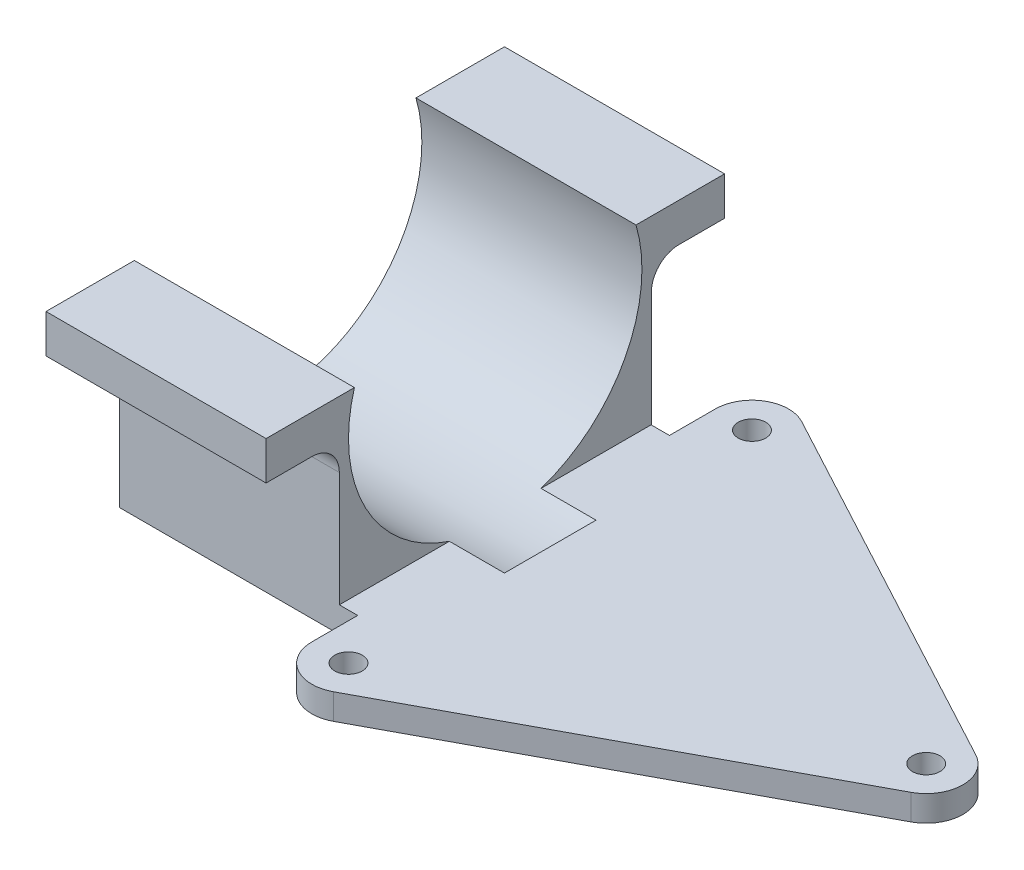
ISO-10303-21;
HEADER;
FILE_DESCRIPTION(('STEP AP214'),'2;1');
FILE_NAME('part.step','',(''),(''),'','','');
FILE_SCHEMA(('AUTOMOTIVE_DESIGN { 1 0 10303 214 1 1 1 1 }'));
ENDSEC;
DATA;
#1=APPLICATION_CONTEXT('core data for automotive mechanical design processes');
#2=APPLICATION_PROTOCOL_DEFINITION('international standard','automotive_design',2000,#1);
#3=PRODUCT_CONTEXT('',#1,'mechanical');
#4=PRODUCT('Part','Part','',(#3));
#5=PRODUCT_RELATED_PRODUCT_CATEGORY('part','',(#4));
#6=PRODUCT_DEFINITION_FORMATION('','',#4);
#7=PRODUCT_DEFINITION_CONTEXT('part definition',#1,'design');
#8=PRODUCT_DEFINITION('design','',#6,#7);
#9=PRODUCT_DEFINITION_SHAPE('','',#8);
#10=(LENGTH_UNIT() NAMED_UNIT(*) SI_UNIT(.MILLI.,.METRE.));
#11=(NAMED_UNIT(*) PLANE_ANGLE_UNIT() SI_UNIT($,.RADIAN.));
#12=(NAMED_UNIT(*) SI_UNIT($,.STERADIAN.) SOLID_ANGLE_UNIT());
#13=UNCERTAINTY_MEASURE_WITH_UNIT(LENGTH_MEASURE(1.E-05),#10,'distance_accuracy_value','');
#14=(GEOMETRIC_REPRESENTATION_CONTEXT(3) GLOBAL_UNCERTAINTY_ASSIGNED_CONTEXT((#13)) GLOBAL_UNIT_ASSIGNED_CONTEXT((#10,
#11,#12)) REPRESENTATION_CONTEXT('',''));
#15=CARTESIAN_POINT('',(0.,0.,0.));
#16=DIRECTION('',(0.,0.,1.));
#17=DIRECTION('',(1.,0.,0.));
#18=AXIS2_PLACEMENT_3D('',#15,#16,#17);
#19=CARTESIAN_POINT('',(-1.99999999999999,18.3,17.));
#20=DIRECTION('',(-1.,0.,0.));
#21=DIRECTION('',(0.,0.,1.));
#22=AXIS2_PLACEMENT_3D('',#19,#20,#21);
#23=PLANE('',#22);
#24=DIRECTION('',(0.,0.,-1.));
#25=VECTOR('',#24,1.);
#26=CARTESIAN_POINT('',(-1.99999999999999,22.5,24.9888259179975));
#27=LINE('',#26,#25);
#28=CARTESIAN_POINT('',(-1.99999999999999,22.5,-15.3541525327841));
#29=VERTEX_POINT('',#28);
#30=CARTESIAN_POINT('',(-1.99999999999999,22.5,-25.0111740820025));
#31=VERTEX_POINT('',#30);
#32=EDGE_CURVE('E566',#29,#31,#27,.T.);
#33=ORIENTED_EDGE('',*,*,#32,.F.);
#34=CARTESIAN_POINT('',(-1.99999999999999,18.,0.));
#35=DIRECTION('',(-1.,0.,0.));
#36=DIRECTION('',(0.,0.,1.));
#37=AXIS2_PLACEMENT_3D('',#34,#35,#36);
#38=CIRCLE('',#37,16.);
#39=CARTESIAN_POINT('',(-2.,2.8,-4.99599839871872));
#40=VERTEX_POINT('',#39);
#41=EDGE_CURVE('E189',#29,#40,#38,.T.);
#42=ORIENTED_EDGE('',*,*,#41,.T.);
#43=DIRECTION('',(0.,0.,-1.));
#44=VECTOR('',#43,1.);
#45=CARTESIAN_POINT('',(-1.99999999999999,2.8,17.));
#46=LINE('',#45,#44);
#47=CARTESIAN_POINT('',(-2.,2.8,-17.));
#48=VERTEX_POINT('',#47);
#49=EDGE_CURVE('E241',#40,#48,#46,.T.);
#50=ORIENTED_EDGE('',*,*,#49,.T.);
#51=CARTESIAN_POINT('',(-2.,2.8,-17.0223481640051));
#52=VERTEX_POINT('',#51);
#53=EDGE_CURVE('E237',#48,#52,#46,.T.);
#54=ORIENTED_EDGE('',*,*,#53,.T.);
#55=DIRECTION('',(0.,-1.,0.));
#56=VECTOR('',#55,1.);
#57=CARTESIAN_POINT('',(-2.,18.3,-17.0223481640051));
#58=LINE('',#57,#56);
#59=CARTESIAN_POINT('',(-2.,15.3,-17.0223481640051));
#60=VERTEX_POINT('',#59);
#61=EDGE_CURVE('E270',#60,#52,#58,.T.);
#62=ORIENTED_EDGE('',*,*,#61,.F.);
#63=CARTESIAN_POINT('',(-2.,15.3,-20.0223494646309));
#64=DIRECTION('',(-1.,0.,0.));
#65=DIRECTION('',(0.,0.,-1.));
#66=AXIS2_PLACEMENT_3D('',#63,#64,#65);
#67=ELLIPSE('',#66,3.00000130062585,3.);
#68=CARTESIAN_POINT('',(-1.99999999999999,18.3,-20.0223494646309));
#69=VERTEX_POINT('',#68);
#70=EDGE_CURVE('E357',#60,#69,#67,.T.);
#71=ORIENTED_EDGE('',*,*,#70,.T.);
#72=DIRECTION('',(0.,0.,-1.));
#73=VECTOR('',#72,1.);
#74=CARTESIAN_POINT('',(-1.99999999999999,18.3,24.9888259179975));
#75=LINE('',#74,#73);
#76=CARTESIAN_POINT('',(-1.99999999999999,18.3,-25.0111740820025));
#77=VERTEX_POINT('',#76);
#78=EDGE_CURVE('E221',#69,#77,#75,.T.);
#79=ORIENTED_EDGE('',*,*,#78,.T.);
#80=DIRECTION('',(0.,-1.,0.));
#81=VECTOR('',#80,1.);
#82=CARTESIAN_POINT('',(-1.99999999999999,22.5,-25.0111740820025));
#83=LINE('',#82,#81);
#84=EDGE_CURVE('E558',#31,#77,#83,.T.);
#85=ORIENTED_EDGE('',*,*,#84,.F.);
#86=EDGE_LOOP('',(#33,#42,#50,#54,#62,#71,#79,#85));
#87=FACE_BOUND('',#86,.T.);
#88=ADVANCED_FACE('F31',(#87),#23,.F.);
#89=CARTESIAN_POINT('',(-1.99999999999999,22.5,24.9888259179975));
#90=DIRECTION('',(0.,1.,0.));
#91=DIRECTION('',(0.,0.,1.));
#92=AXIS2_PLACEMENT_3D('',#89,#90,#91);
#93=PLANE('',#92);
#94=DIRECTION('',(-1.,0.,0.));
#95=VECTOR('',#94,1.);
#96=CARTESIAN_POINT('',(4.,22.5,-15.3541525327841));
#97=LINE('',#96,#95);
#98=CARTESIAN_POINT('',(-26.,22.5,-15.3541525327841));
#99=VERTEX_POINT('',#98);
#100=EDGE_CURVE('E183',#29,#99,#97,.T.);
#101=ORIENTED_EDGE('',*,*,#100,.F.);
#102=ORIENTED_EDGE('',*,*,#32,.T.);
#103=DIRECTION('',(-1.,0.,0.));
#104=VECTOR('',#103,1.);
#105=CARTESIAN_POINT('',(-1.99999999999999,22.5,-25.0111740820025));
#106=LINE('',#105,#104);
#107=CARTESIAN_POINT('',(-26.,22.5,-25.0111740820025));
#108=VERTEX_POINT('',#107);
#109=EDGE_CURVE('E208',#31,#108,#106,.T.);
#110=ORIENTED_EDGE('',*,*,#109,.T.);
#111=DIRECTION('',(0.,0.,1.));
#112=VECTOR('',#111,1.);
#113=CARTESIAN_POINT('',(-26.,22.5,-25.0111740820025));
#114=LINE('',#113,#112);
#115=EDGE_CURVE('E201',#108,#99,#114,.T.);
#116=ORIENTED_EDGE('',*,*,#115,.T.);
#117=EDGE_LOOP('',(#101,#102,#110,#116));
#118=FACE_BOUND('',#117,.T.);
#119=ADVANCED_FACE('F206',(#118),#93,.T.);
#120=CARTESIAN_POINT('',(4.,2.8,-22.));
#121=DIRECTION('',(0.,1.,0.));
#122=DIRECTION('',(0.,0.,1.));
#123=AXIS2_PLACEMENT_3D('',#120,#121,#122);
#124=PLANE('',#123);
#125=DIRECTION('',(-1.,0.,0.));
#126=VECTOR('',#125,1.);
#127=CARTESIAN_POINT('',(4.,2.8,-4.99599839871872));
#128=LINE('',#127,#126);
#129=CARTESIAN_POINT('',(4.,2.8,-4.99599839871872));
#130=VERTEX_POINT('',#129);
#131=EDGE_CURVE('E222',#130,#40,#128,.T.);
#132=ORIENTED_EDGE('',*,*,#131,.F.);
#133=DIRECTION('',(0.,0.,1.));
#134=VECTOR('',#133,1.);
#135=CARTESIAN_POINT('',(4.,2.8,-22.));
#136=LINE('',#135,#134);
#137=CARTESIAN_POINT('',(4.,2.8,4.99599839871872));
#138=VERTEX_POINT('',#137);
#139=EDGE_CURVE('E193',#130,#138,#136,.T.);
#140=ORIENTED_EDGE('',*,*,#139,.T.);
#141=DIRECTION('',(-1.,0.,0.));
#142=VECTOR('',#141,1.);
#143=CARTESIAN_POINT('',(4.,2.8,4.99599839871872));
#144=LINE('',#143,#142);
#145=CARTESIAN_POINT('',(-1.99999999999999,2.8,4.99599839871872));
#146=VERTEX_POINT('',#145);
#147=EDGE_CURVE('E385',#146,#138,#144,.F.);
#148=ORIENTED_EDGE('',*,*,#147,.F.);
#149=CARTESIAN_POINT('',(-2.00000000000001,2.8,17.));
#150=VERTEX_POINT('',#149);
#151=EDGE_CURVE('E247',#150,#146,#46,.T.);
#152=ORIENTED_EDGE('',*,*,#151,.F.);
#153=DIRECTION('',(1.,0.,0.));
#154=VECTOR('',#153,1.);
#155=CARTESIAN_POINT('',(-26.,2.8,17.));
#156=LINE('',#155,#154);
#157=CARTESIAN_POINT('',(0.,2.8,17.));
#158=VERTEX_POINT('',#157);
#159=EDGE_CURVE('E289',#150,#158,#156,.T.);
#160=ORIENTED_EDGE('',*,*,#159,.T.);
#161=DIRECTION('',(0.,0.,1.));
#162=VECTOR('',#161,1.);
#163=CARTESIAN_POINT('',(0.,2.8,17.));
#164=LINE('',#163,#162);
#165=CARTESIAN_POINT('',(0.,2.8,22.));
#166=VERTEX_POINT('',#165);
#167=EDGE_CURVE('E291',#158,#166,#164,.T.);
#168=ORIENTED_EDGE('',*,*,#167,.T.);
#169=CARTESIAN_POINT('',(4.00000000000001,2.8,22.));
#170=DIRECTION('',(0.,1.,0.));
#171=DIRECTION('',(0.,0.,-1.));
#172=AXIS2_PLACEMENT_3D('',#169,#170,#171);
#173=CIRCLE('',#172,4.);
#174=CARTESIAN_POINT('',(5.89127081925839,2.8,25.5246410722543));
#175=VERTEX_POINT('',#174);
#176=EDGE_CURVE('E298',#166,#175,#173,.T.);
#177=ORIENTED_EDGE('',*,*,#176,.T.);
#178=DIRECTION('',(0.881160268063567,0.,-0.472817704814597));
#179=VECTOR('',#178,1.);
#180=CARTESIAN_POINT('',(5.89127081925839,2.8,25.5246410722543));
#181=LINE('',#180,#179);
#182=CARTESIAN_POINT('',(46.8912708192584,2.8,3.52464107225426));
#183=VERTEX_POINT('',#182);
#184=EDGE_CURVE('E300',#175,#183,#181,.T.);
#185=ORIENTED_EDGE('',*,*,#184,.T.);
#186=CARTESIAN_POINT('',(45.,2.8,0.));
#187=DIRECTION('',(0.,1.,0.));
#188=DIRECTION('',(0.,0.,1.));
#189=AXIS2_PLACEMENT_3D('',#186,#187,#188);
#190=CIRCLE('',#189,3.99999999999999);
#191=CARTESIAN_POINT('',(46.8912708192584,2.8,-3.52464107225426));
#192=VERTEX_POINT('',#191);
#193=EDGE_CURVE('E302',#183,#192,#190,.T.);
#194=ORIENTED_EDGE('',*,*,#193,.T.);
#195=DIRECTION('',(-0.881160268063567,0.,-0.472817704814597));
#196=VECTOR('',#195,1.);
#197=CARTESIAN_POINT('',(5.89127081925839,2.8,-25.5246410722543));
#198=LINE('',#197,#196);
#199=CARTESIAN_POINT('',(5.89127081925839,2.8,-25.5246410722543));
#200=VERTEX_POINT('',#199);
#201=EDGE_CURVE('E304',#192,#200,#198,.T.);
#202=ORIENTED_EDGE('',*,*,#201,.T.);
#203=CARTESIAN_POINT('',(4.,2.8,-22.));
#204=DIRECTION('',(0.,1.,0.));
#205=DIRECTION('',(0.,0.,1.));
#206=AXIS2_PLACEMENT_3D('',#203,#204,#205);
#207=CIRCLE('',#206,4.);
#208=CARTESIAN_POINT('',(0.,2.8,-22.));
#209=VERTEX_POINT('',#208);
#210=EDGE_CURVE('E330',#200,#209,#207,.T.);
#211=ORIENTED_EDGE('',*,*,#210,.T.);
#212=DIRECTION('',(0.,0.,1.));
#213=VECTOR('',#212,1.);
#214=CARTESIAN_POINT('',(0.,2.8,-22.));
#215=LINE('',#214,#213);
#216=CARTESIAN_POINT('',(0.,2.8,-17.));
#217=VERTEX_POINT('',#216);
#218=EDGE_CURVE('E418',#209,#217,#215,.T.);
#219=ORIENTED_EDGE('',*,*,#218,.T.);
#220=DIRECTION('',(-1.,0.,0.));
#221=VECTOR('',#220,1.);
#222=CARTESIAN_POINT('',(-26.,2.8,-17.));
#223=LINE('',#222,#221);
#224=EDGE_CURVE('E292',#217,#48,#223,.T.);
#225=ORIENTED_EDGE('',*,*,#224,.T.);
#226=ORIENTED_EDGE('',*,*,#49,.F.);
#227=EDGE_LOOP('',(#132,#140,#148,#152,#160,#168,#177,#185,#194,#202,#211,#219,#225,#226));
#228=FACE_BOUND('',#227,.T.);
#229=CARTESIAN_POINT('',(4.00000000000001,2.8,22.));
#230=DIRECTION('',(0.,1.,0.));
#231=DIRECTION('',(0.,0.,1.));
#232=AXIS2_PLACEMENT_3D('',#229,#230,#231);
#233=CIRCLE('',#232,1.5);
#234=CARTESIAN_POINT('',(4.00000000000001,2.8,23.5));
#235=VERTEX_POINT('',#234);
#236=EDGE_CURVE('E425',#235,#235,#233,.T.);
#237=ORIENTED_EDGE('',*,*,#236,.F.);
#238=EDGE_LOOP('',(#237));
#239=FACE_BOUND('',#238,.T.);
#240=CARTESIAN_POINT('',(4.,2.8,-22.));
#241=DIRECTION('',(0.,1.,0.));
#242=DIRECTION('',(0.,0.,1.));
#243=AXIS2_PLACEMENT_3D('',#240,#241,#242);
#244=CIRCLE('',#243,1.5);
#245=CARTESIAN_POINT('',(4.,2.8,-20.5));
#246=VERTEX_POINT('',#245);
#247=EDGE_CURVE('E310',#246,#246,#244,.T.);
#248=ORIENTED_EDGE('',*,*,#247,.F.);
#249=EDGE_LOOP('',(#248));
#250=FACE_BOUND('',#249,.T.);
#251=CARTESIAN_POINT('',(45.,2.8,0.));
#252=DIRECTION('',(0.,1.,0.));
#253=DIRECTION('',(0.,0.,1.));
#254=AXIS2_PLACEMENT_3D('',#251,#252,#253);
#255=CIRCLE('',#254,1.5);
#256=CARTESIAN_POINT('',(45.,2.8,1.5));
#257=VERTEX_POINT('',#256);
#258=EDGE_CURVE('E431',#257,#257,#255,.T.);
#259=ORIENTED_EDGE('',*,*,#258,.F.);
#260=EDGE_LOOP('',(#259));
#261=FACE_BOUND('',#260,.T.);
#262=ADVANCED_FACE('F382',(#228,#239,#250,#261),#124,.T.);
#263=CARTESIAN_POINT('',(4.,0.,-22.));
#264=DIRECTION('',(0.,1.,0.));
#265=DIRECTION('',(0.,0.,1.));
#266=AXIS2_PLACEMENT_3D('',#263,#264,#265);
#267=PLANE('',#266);
#268=CARTESIAN_POINT('',(4.00000000000001,0.,22.));
#269=DIRECTION('',(0.,1.,0.));
#270=DIRECTION('',(0.,0.,1.));
#271=AXIS2_PLACEMENT_3D('',#268,#269,#270);
#272=CIRCLE('',#271,1.5);
#273=CARTESIAN_POINT('',(4.00000000000001,0.,23.5));
#274=VERTEX_POINT('',#273);
#275=EDGE_CURVE('E428',#274,#274,#272,.T.);
#276=ORIENTED_EDGE('',*,*,#275,.T.);
#277=EDGE_LOOP('',(#276));
#278=FACE_BOUND('',#277,.T.);
#279=CARTESIAN_POINT('',(4.,0.,-22.));
#280=DIRECTION('',(0.,1.,0.));
#281=DIRECTION('',(0.,0.,1.));
#282=AXIS2_PLACEMENT_3D('',#279,#280,#281);
#283=CIRCLE('',#282,4.);
#284=CARTESIAN_POINT('',(5.89127081925839,0.,-25.5246410722543));
#285=VERTEX_POINT('',#284);
#286=CARTESIAN_POINT('',(0.,0.,-22.));
#287=VERTEX_POINT('',#286);
#288=EDGE_CURVE('E307',#285,#287,#283,.T.);
#289=ORIENTED_EDGE('',*,*,#288,.F.);
#290=DIRECTION('',(-0.881160268063567,0.,-0.472817704814597));
#291=VECTOR('',#290,1.);
#292=CARTESIAN_POINT('',(5.89127081925839,0.,-25.5246410722543));
#293=LINE('',#292,#291);
#294=CARTESIAN_POINT('',(46.8912708192584,0.,-3.52464107225426));
#295=VERTEX_POINT('',#294);
#296=EDGE_CURVE('E328',#295,#285,#293,.T.);
#297=ORIENTED_EDGE('',*,*,#296,.F.);
#298=CARTESIAN_POINT('',(45.,0.,0.));
#299=DIRECTION('',(0.,1.,0.));
#300=DIRECTION('',(0.,0.,1.));
#301=AXIS2_PLACEMENT_3D('',#298,#299,#300);
#302=CIRCLE('',#301,3.99999999999999);
#303=CARTESIAN_POINT('',(46.8912708192584,0.,3.52464107225426));
#304=VERTEX_POINT('',#303);
#305=EDGE_CURVE('E326',#304,#295,#302,.T.);
#306=ORIENTED_EDGE('',*,*,#305,.F.);
#307=DIRECTION('',(0.881160268063567,0.,-0.472817704814597));
#308=VECTOR('',#307,1.);
#309=CARTESIAN_POINT('',(5.89127081925839,0.,25.5246410722543));
#310=LINE('',#309,#308);
#311=CARTESIAN_POINT('',(5.89127081925839,0.,25.5246410722543));
#312=VERTEX_POINT('',#311);
#313=EDGE_CURVE('E324',#312,#304,#310,.T.);
#314=ORIENTED_EDGE('',*,*,#313,.F.);
#315=CARTESIAN_POINT('',(4.00000000000001,0.,22.));
#316=DIRECTION('',(0.,1.,0.));
#317=DIRECTION('',(0.,0.,-1.));
#318=AXIS2_PLACEMENT_3D('',#315,#316,#317);
#319=CIRCLE('',#318,4.);
#320=CARTESIAN_POINT('',(0.,0.,22.));
#321=VERTEX_POINT('',#320);
#322=EDGE_CURVE('E322',#321,#312,#319,.T.);
#323=ORIENTED_EDGE('',*,*,#322,.F.);
#324=DIRECTION('',(0.,0.,1.));
#325=VECTOR('',#324,1.);
#326=CARTESIAN_POINT('',(0.,0.,17.));
#327=LINE('',#326,#325);
#328=CARTESIAN_POINT('',(0.,0.,17.));
#329=VERTEX_POINT('',#328);
#330=EDGE_CURVE('E320',#329,#321,#327,.T.);
#331=ORIENTED_EDGE('',*,*,#330,.F.);
#332=DIRECTION('',(1.,0.,0.));
#333=VECTOR('',#332,1.);
#334=CARTESIAN_POINT('',(-26.,0.,17.));
#335=LINE('',#334,#333);
#336=CARTESIAN_POINT('',(-26.,0.,17.));
#337=VERTEX_POINT('',#336);
#338=EDGE_CURVE('E318',#337,#329,#335,.T.);
#339=ORIENTED_EDGE('',*,*,#338,.F.);
#340=DIRECTION('',(0.,0.,1.));
#341=VECTOR('',#340,1.);
#342=CARTESIAN_POINT('',(-26.,0.,0.));
#343=LINE('',#342,#341);
#344=CARTESIAN_POINT('',(-26.,0.,-17.));
#345=VERTEX_POINT('',#344);
#346=EDGE_CURVE('E315',#345,#337,#343,.T.);
#347=ORIENTED_EDGE('',*,*,#346,.F.);
#348=DIRECTION('',(-1.,0.,0.));
#349=VECTOR('',#348,1.);
#350=CARTESIAN_POINT('',(-26.,0.,-17.));
#351=LINE('',#350,#349);
#352=CARTESIAN_POINT('',(0.,0.,-17.));
#353=VERTEX_POINT('',#352);
#354=EDGE_CURVE('E312',#353,#345,#351,.T.);
#355=ORIENTED_EDGE('',*,*,#354,.F.);
#356=DIRECTION('',(0.,0.,1.));
#357=VECTOR('',#356,1.);
#358=CARTESIAN_POINT('',(0.,0.,-22.));
#359=LINE('',#358,#357);
#360=EDGE_CURVE('E309',#287,#353,#359,.T.);
#361=ORIENTED_EDGE('',*,*,#360,.F.);
#362=EDGE_LOOP('',(#289,#297,#306,#314,#323,#331,#339,#347,#355,#361));
#363=FACE_BOUND('',#362,.T.);
#364=CARTESIAN_POINT('',(4.,0.,-22.));
#365=DIRECTION('',(0.,1.,0.));
#366=DIRECTION('',(0.,0.,1.));
#367=AXIS2_PLACEMENT_3D('',#364,#365,#366);
#368=CIRCLE('',#367,1.5);
#369=CARTESIAN_POINT('',(4.,0.,-20.5));
#370=VERTEX_POINT('',#369);
#371=EDGE_CURVE('E422',#370,#370,#368,.T.);
#372=ORIENTED_EDGE('',*,*,#371,.T.);
#373=EDGE_LOOP('',(#372));
#374=FACE_BOUND('',#373,.T.);
#375=CARTESIAN_POINT('',(45.,0.,0.));
#376=DIRECTION('',(0.,1.,0.));
#377=DIRECTION('',(0.,0.,1.));
#378=AXIS2_PLACEMENT_3D('',#375,#376,#377);
#379=CIRCLE('',#378,1.5);
#380=CARTESIAN_POINT('',(45.,0.,1.5));
#381=VERTEX_POINT('',#380);
#382=EDGE_CURVE('E434',#381,#381,#379,.T.);
#383=ORIENTED_EDGE('',*,*,#382,.T.);
#384=EDGE_LOOP('',(#383));
#385=FACE_BOUND('',#384,.T.);
#386=ADVANCED_FACE('F443',(#278,#363,#374,#385),#267,.F.);
#387=CARTESIAN_POINT('',(4.,2.8,-22.));
#388=DIRECTION('',(0.,-1.,0.));
#389=DIRECTION('',(0.,0.,-1.));
#390=AXIS2_PLACEMENT_3D('',#387,#388,#389);
#391=CYLINDRICAL_SURFACE('',#390,4.);
#392=ORIENTED_EDGE('',*,*,#288,.T.);
#393=DIRECTION('',(0.,-1.,0.));
#394=VECTOR('',#393,1.);
#395=CARTESIAN_POINT('',(0.,2.8,-22.));
#396=LINE('',#395,#394);
#397=EDGE_CURVE('E277',#209,#287,#396,.T.);
#398=ORIENTED_EDGE('',*,*,#397,.F.);
#399=ORIENTED_EDGE('',*,*,#210,.F.);
#400=DIRECTION('',(0.,-1.,0.));
#401=VECTOR('',#400,1.);
#402=CARTESIAN_POINT('',(5.89127081925839,2.8,-25.5246410722543));
#403=LINE('',#402,#401);
#404=EDGE_CURVE('E306',#200,#285,#403,.T.);
#405=ORIENTED_EDGE('',*,*,#404,.T.);
#406=EDGE_LOOP('',(#392,#398,#399,#405));
#407=FACE_BOUND('',#406,.T.);
#408=ADVANCED_FACE('F417',(#407),#391,.T.);
#409=CARTESIAN_POINT('',(0.,2.8,-22.));
#410=DIRECTION('',(1.,0.,0.));
#411=DIRECTION('',(0.,0.,-1.));
#412=AXIS2_PLACEMENT_3D('',#409,#410,#411);
#413=PLANE('',#412);
#414=ORIENTED_EDGE('',*,*,#360,.T.);
#415=DIRECTION('',(0.,-1.,0.));
#416=VECTOR('',#415,1.);
#417=CARTESIAN_POINT('',(0.,2.8,-17.));
#418=LINE('',#417,#416);
#419=EDGE_CURVE('E280',#217,#353,#418,.T.);
#420=ORIENTED_EDGE('',*,*,#419,.F.);
#421=ORIENTED_EDGE('',*,*,#218,.F.);
#422=ORIENTED_EDGE('',*,*,#397,.T.);
#423=EDGE_LOOP('',(#414,#420,#421,#422));
#424=FACE_BOUND('',#423,.T.);
#425=ADVANCED_FACE('F504',(#424),#413,.F.);
#426=CARTESIAN_POINT('',(-26.,2.8,-17.));
#427=DIRECTION('',(0.,0.,1.));
#428=DIRECTION('',(1.,0.,0.));
#429=AXIS2_PLACEMENT_3D('',#426,#427,#428);
#430=PLANE('',#429);
#431=ORIENTED_EDGE('',*,*,#354,.T.);
#432=DIRECTION('',(0.,-1.,0.));
#433=VECTOR('',#432,1.);
#434=CARTESIAN_POINT('',(-26.,2.8,-17.));
#435=LINE('',#434,#433);
#436=CARTESIAN_POINT('',(-26.,2.8,-17.));
#437=VERTEX_POINT('',#436);
#438=EDGE_CURVE('E286',#437,#345,#435,.T.);
#439=ORIENTED_EDGE('',*,*,#438,.F.);
#440=EDGE_CURVE('E420',#48,#437,#223,.T.);
#441=ORIENTED_EDGE('',*,*,#440,.F.);
#442=ORIENTED_EDGE('',*,*,#224,.F.);
#443=ORIENTED_EDGE('',*,*,#419,.T.);
#444=EDGE_LOOP('',(#431,#439,#441,#442,#443));
#445=FACE_BOUND('',#444,.T.);
#446=ADVANCED_FACE('F501',(#445),#430,.F.);
#447=CARTESIAN_POINT('',(-26.,2.8,0.));
#448=DIRECTION('',(1.,0.,0.));
#449=DIRECTION('',(0.,0.,-1.));
#450=AXIS2_PLACEMENT_3D('',#447,#448,#449);
#451=PLANE('',#450);
#452=CARTESIAN_POINT('',(-26.,22.5,15.3541525327841));
#453=VERTEX_POINT('',#452);
#454=CARTESIAN_POINT('',(-26.,22.5,24.9888259179975));
#455=VERTEX_POINT('',#454);
#456=EDGE_CURVE('E203',#453,#455,#114,.T.);
#457=ORIENTED_EDGE('',*,*,#456,.F.);
#458=CARTESIAN_POINT('',(-26.,18.,0.));
#459=DIRECTION('',(-1.,0.,0.));
#460=DIRECTION('',(0.,0.,1.));
#461=AXIS2_PLACEMENT_3D('',#458,#459,#460);
#462=CIRCLE('',#461,16.);
#463=EDGE_CURVE('E186',#99,#453,#462,.T.);
#464=ORIENTED_EDGE('',*,*,#463,.F.);
#465=ORIENTED_EDGE('',*,*,#115,.F.);
#466=DIRECTION('',(0.,-1.,0.));
#467=VECTOR('',#466,1.);
#468=CARTESIAN_POINT('',(-26.,22.5,-25.0111740820025));
#469=LINE('',#468,#467);
#470=CARTESIAN_POINT('',(-26.,18.3,-25.0111740820025));
#471=VERTEX_POINT('',#470);
#472=EDGE_CURVE('E213',#108,#471,#469,.T.);
#473=ORIENTED_EDGE('',*,*,#472,.T.);
#474=DIRECTION('',(0.,0.,1.));
#475=VECTOR('',#474,1.);
#476=CARTESIAN_POINT('',(-26.,18.3,-25.0111740820025));
#477=LINE('',#476,#475);
#478=CARTESIAN_POINT('',(-26.,18.3,-20.0000013006259));
#479=VERTEX_POINT('',#478);
#480=EDGE_CURVE('E235',#471,#479,#477,.T.);
#481=ORIENTED_EDGE('',*,*,#480,.T.);
#482=CARTESIAN_POINT('',(-26.,15.3,-20.0000013006259));
#483=DIRECTION('',(1.,0.,0.));
#484=DIRECTION('',(0.,0.,-1.));
#485=AXIS2_PLACEMENT_3D('',#482,#483,#484);
#486=ELLIPSE('',#485,3.00000130062585,3.);
#487=CARTESIAN_POINT('',(-26.,15.3,-17.));
#488=VERTEX_POINT('',#487);
#489=EDGE_CURVE('E355',#479,#488,#486,.T.);
#490=ORIENTED_EDGE('',*,*,#489,.T.);
#491=DIRECTION('',(0.,-1.,0.));
#492=VECTOR('',#491,1.);
#493=CARTESIAN_POINT('',(-26.,18.3,-17.));
#494=LINE('',#493,#492);
#495=EDGE_CURVE('E267',#488,#437,#494,.T.);
#496=ORIENTED_EDGE('',*,*,#495,.T.);
#497=ORIENTED_EDGE('',*,*,#438,.T.);
#498=ORIENTED_EDGE('',*,*,#346,.T.);
#499=DIRECTION('',(0.,-1.,0.));
#500=VECTOR('',#499,1.);
#501=CARTESIAN_POINT('',(-26.,2.8,17.));
#502=LINE('',#501,#500);
#503=CARTESIAN_POINT('',(-26.,15.3,17.));
#504=VERTEX_POINT('',#503);
#505=EDGE_CURVE('E347',#504,#337,#502,.T.);
#506=ORIENTED_EDGE('',*,*,#505,.F.);
#507=CARTESIAN_POINT('',(-26.,15.3,20.));
#508=DIRECTION('',(1.,0.,0.));
#509=DIRECTION('',(0.,0.,-1.));
#510=AXIS2_PLACEMENT_3D('',#507,#508,#509);
#511=CIRCLE('',#510,3.);
#512=CARTESIAN_POINT('',(-26.,18.3,20.));
#513=VERTEX_POINT('',#512);
#514=EDGE_CURVE('E11',#504,#513,#511,.T.);
#515=ORIENTED_EDGE('',*,*,#514,.T.);
#516=CARTESIAN_POINT('',(-26.,18.3,24.9888259179975));
#517=VERTEX_POINT('',#516);
#518=EDGE_CURVE('E553',#513,#517,#477,.T.);
#519=ORIENTED_EDGE('',*,*,#518,.T.);
#520=DIRECTION('',(0.,-1.,0.));
#521=VECTOR('',#520,1.);
#522=CARTESIAN_POINT('',(-26.,22.5,24.9888259179975));
#523=LINE('',#522,#521);
#524=EDGE_CURVE('E210',#455,#517,#523,.T.);
#525=ORIENTED_EDGE('',*,*,#524,.F.);
#526=EDGE_LOOP('',(#457,#464,#465,#473,#481,#490,#496,#497,#498,#506,#515,#519,#525));
#527=FACE_BOUND('',#526,.T.);
#528=ADVANCED_FACE('F199',(#527),#451,.F.);
#529=CARTESIAN_POINT('',(-26.,2.8,17.));
#530=DIRECTION('',(0.,0.,-1.));
#531=DIRECTION('',(-1.,0.,0.));
#532=AXIS2_PLACEMENT_3D('',#529,#530,#531);
#533=PLANE('',#532);
#534=DIRECTION('',(0.,-1.,0.));
#535=VECTOR('',#534,1.);
#536=CARTESIAN_POINT('',(-1.99999999999999,18.3,17.));
#537=LINE('',#536,#535);
#538=CARTESIAN_POINT('',(-1.99999999999999,15.3,17.));
#539=VERTEX_POINT('',#538);
#540=EDGE_CURVE('E271',#539,#150,#537,.T.);
#541=ORIENTED_EDGE('',*,*,#540,.F.);
#542=DIRECTION('',(1.,0.,0.));
#543=VECTOR('',#542,1.);
#544=CARTESIAN_POINT('',(-26.,15.3,17.));
#545=LINE('',#544,#543);
#546=EDGE_CURVE('E46',#539,#504,#545,.F.);
#547=ORIENTED_EDGE('',*,*,#546,.T.);
#548=ORIENTED_EDGE('',*,*,#505,.T.);
#549=ORIENTED_EDGE('',*,*,#338,.T.);
#550=DIRECTION('',(0.,-1.,0.));
#551=VECTOR('',#550,1.);
#552=CARTESIAN_POINT('',(0.,2.8,17.));
#553=LINE('',#552,#551);
#554=EDGE_CURVE('E345',#158,#329,#553,.T.);
#555=ORIENTED_EDGE('',*,*,#554,.F.);
#556=ORIENTED_EDGE('',*,*,#159,.F.);
#557=EDGE_LOOP('',(#541,#547,#548,#549,#555,#556));
#558=FACE_BOUND('',#557,.T.);
#559=ADVANCED_FACE('F386',(#558),#533,.F.);
#560=CARTESIAN_POINT('',(0.,2.8,17.));
#561=DIRECTION('',(1.,0.,0.));
#562=DIRECTION('',(0.,0.,-1.));
#563=AXIS2_PLACEMENT_3D('',#560,#561,#562);
#564=PLANE('',#563);
#565=ORIENTED_EDGE('',*,*,#330,.T.);
#566=DIRECTION('',(0.,-1.,0.));
#567=VECTOR('',#566,1.);
#568=CARTESIAN_POINT('',(0.,2.8,22.));
#569=LINE('',#568,#567);
#570=EDGE_CURVE('E342',#166,#321,#569,.T.);
#571=ORIENTED_EDGE('',*,*,#570,.F.);
#572=ORIENTED_EDGE('',*,*,#167,.F.);
#573=ORIENTED_EDGE('',*,*,#554,.T.);
#574=EDGE_LOOP('',(#565,#571,#572,#573));
#575=FACE_BOUND('',#574,.T.);
#576=ADVANCED_FACE('F392',(#575),#564,.F.);
#577=CARTESIAN_POINT('',(4.00000000000001,2.8,22.));
#578=DIRECTION('',(0.,-1.,0.));
#579=DIRECTION('',(0.,0.,-1.));
#580=AXIS2_PLACEMENT_3D('',#577,#578,#579);
#581=CYLINDRICAL_SURFACE('',#580,4.);
#582=ORIENTED_EDGE('',*,*,#322,.T.);
#583=DIRECTION('',(0.,-1.,0.));
#584=VECTOR('',#583,1.);
#585=CARTESIAN_POINT('',(5.89127081925839,2.8,25.5246410722543));
#586=LINE('',#585,#584);
#587=EDGE_CURVE('E339',#175,#312,#586,.T.);
#588=ORIENTED_EDGE('',*,*,#587,.F.);
#589=ORIENTED_EDGE('',*,*,#176,.F.);
#590=ORIENTED_EDGE('',*,*,#570,.T.);
#591=EDGE_LOOP('',(#582,#588,#589,#590));
#592=FACE_BOUND('',#591,.T.);
#593=ADVANCED_FACE('F398',(#592),#581,.T.);
#594=CARTESIAN_POINT('',(5.89127081925839,2.8,25.5246410722543));
#595=DIRECTION('',(-0.472817704814597,0.,-0.881160268063567));
#596=DIRECTION('',(-0.881160268063567,0.,0.472817704814597));
#597=AXIS2_PLACEMENT_3D('',#594,#595,#596);
#598=PLANE('',#597);
#599=ORIENTED_EDGE('',*,*,#313,.T.);
#600=DIRECTION('',(0.,-1.,0.));
#601=VECTOR('',#600,1.);
#602=CARTESIAN_POINT('',(46.8912708192584,2.8,3.52464107225426));
#603=LINE('',#602,#601);
#604=EDGE_CURVE('E336',#183,#304,#603,.T.);
#605=ORIENTED_EDGE('',*,*,#604,.F.);
#606=ORIENTED_EDGE('',*,*,#184,.F.);
#607=ORIENTED_EDGE('',*,*,#587,.T.);
#608=EDGE_LOOP('',(#599,#605,#606,#607));
#609=FACE_BOUND('',#608,.T.);
#610=ADVANCED_FACE('F402',(#609),#598,.F.);
#611=CARTESIAN_POINT('',(45.,2.8,0.));
#612=DIRECTION('',(0.,-1.,0.));
#613=DIRECTION('',(0.,0.,-1.));
#614=AXIS2_PLACEMENT_3D('',#611,#612,#613);
#615=CYLINDRICAL_SURFACE('',#614,3.99999999999999);
#616=ORIENTED_EDGE('',*,*,#305,.T.);
#617=DIRECTION('',(0.,-1.,0.));
#618=VECTOR('',#617,1.);
#619=CARTESIAN_POINT('',(46.8912708192584,2.8,-3.52464107225426));
#620=LINE('',#619,#618);
#621=EDGE_CURVE('E333',#192,#295,#620,.T.);
#622=ORIENTED_EDGE('',*,*,#621,.F.);
#623=ORIENTED_EDGE('',*,*,#193,.F.);
#624=ORIENTED_EDGE('',*,*,#604,.T.);
#625=EDGE_LOOP('',(#616,#622,#623,#624));
#626=FACE_BOUND('',#625,.T.);
#627=ADVANCED_FACE('F407',(#626),#615,.T.);
#628=CARTESIAN_POINT('',(5.89127081925839,2.8,-25.5246410722543));
#629=DIRECTION('',(-0.472817704814597,0.,0.881160268063567));
#630=DIRECTION('',(0.881160268063567,0.,0.472817704814597));
#631=AXIS2_PLACEMENT_3D('',#628,#629,#630);
#632=PLANE('',#631);
#633=ORIENTED_EDGE('',*,*,#296,.T.);
#634=ORIENTED_EDGE('',*,*,#404,.F.);
#635=ORIENTED_EDGE('',*,*,#201,.F.);
#636=ORIENTED_EDGE('',*,*,#621,.T.);
#637=EDGE_LOOP('',(#633,#634,#635,#636));
#638=FACE_BOUND('',#637,.T.);
#639=ADVANCED_FACE('F413',(#638),#632,.F.);
#640=CARTESIAN_POINT('',(4.,2.8,-22.));
#641=DIRECTION('',(0.,-1.,0.));
#642=DIRECTION('',(0.,0.,-1.));
#643=AXIS2_PLACEMENT_3D('',#640,#641,#642);
#644=CYLINDRICAL_SURFACE('',#643,1.5);
#645=ORIENTED_EDGE('',*,*,#247,.T.);
#646=EDGE_LOOP('',(#645));
#647=FACE_BOUND('',#646,.T.);
#648=ORIENTED_EDGE('',*,*,#371,.F.);
#649=EDGE_LOOP('',(#648));
#650=FACE_BOUND('',#649,.T.);
#651=ADVANCED_FACE('F470',(#647,#650),#644,.F.);
#652=CARTESIAN_POINT('',(4.00000000000001,2.8,22.));
#653=DIRECTION('',(0.,-1.,0.));
#654=DIRECTION('',(0.,0.,-1.));
#655=AXIS2_PLACEMENT_3D('',#652,#653,#654);
#656=CYLINDRICAL_SURFACE('',#655,1.5);
#657=ORIENTED_EDGE('',*,*,#236,.T.);
#658=EDGE_LOOP('',(#657));
#659=FACE_BOUND('',#658,.T.);
#660=ORIENTED_EDGE('',*,*,#275,.F.);
#661=EDGE_LOOP('',(#660));
#662=FACE_BOUND('',#661,.T.);
#663=ADVANCED_FACE('F466',(#659,#662),#656,.F.);
#664=CARTESIAN_POINT('',(45.,2.8,0.));
#665=DIRECTION('',(0.,-1.,0.));
#666=DIRECTION('',(0.,0.,-1.));
#667=AXIS2_PLACEMENT_3D('',#664,#665,#666);
#668=CYLINDRICAL_SURFACE('',#667,1.5);
#669=ORIENTED_EDGE('',*,*,#258,.T.);
#670=EDGE_LOOP('',(#669));
#671=FACE_BOUND('',#670,.T.);
#672=ORIENTED_EDGE('',*,*,#382,.F.);
#673=EDGE_LOOP('',(#672));
#674=FACE_BOUND('',#673,.T.);
#675=ADVANCED_FACE('F439',(#671,#674),#668,.F.);
#676=ORIENTED_EDGE('',*,*,#151,.T.);
#677=CARTESIAN_POINT('',(-1.99999999999999,22.5,15.3541525327841));
#678=VERTEX_POINT('',#677);
#679=EDGE_CURVE('E379',#146,#678,#38,.T.);
#680=ORIENTED_EDGE('',*,*,#679,.T.);
#681=CARTESIAN_POINT('',(-1.99999999999999,22.5,24.9888259179975));
#682=VERTEX_POINT('',#681);
#683=EDGE_CURVE('E561',#682,#678,#27,.T.);
#684=ORIENTED_EDGE('',*,*,#683,.F.);
#685=DIRECTION('',(0.,-1.,0.));
#686=VECTOR('',#685,1.);
#687=CARTESIAN_POINT('',(-1.99999999999999,22.5,24.9888259179975));
#688=LINE('',#687,#686);
#689=CARTESIAN_POINT('',(-1.99999999999999,18.3,24.9888259179975));
#690=VERTEX_POINT('',#689);
#691=EDGE_CURVE('E242',#682,#690,#688,.T.);
#692=ORIENTED_EDGE('',*,*,#691,.T.);
#693=CARTESIAN_POINT('',(-1.99999999999999,18.3,20.));
#694=VERTEX_POINT('',#693);
#695=EDGE_CURVE('E232',#690,#694,#75,.T.);
#696=ORIENTED_EDGE('',*,*,#695,.T.);
#697=CARTESIAN_POINT('',(-1.99999999999999,15.3,20.));
#698=DIRECTION('',(-1.,0.,0.));
#699=DIRECTION('',(0.,0.,1.));
#700=AXIS2_PLACEMENT_3D('',#697,#698,#699);
#701=CIRCLE('',#700,3.);
#702=EDGE_CURVE('E39',#694,#539,#701,.T.);
#703=ORIENTED_EDGE('',*,*,#702,.T.);
#704=ORIENTED_EDGE('',*,*,#540,.T.);
#705=EDGE_LOOP('',(#676,#680,#684,#692,#696,#703,#704));
#706=FACE_BOUND('',#705,.T.);
#707=ADVANCED_FACE('F378',(#706),#23,.F.);
#708=CARTESIAN_POINT('',(-2.,18.3,-17.0223481640051));
#709=DIRECTION('',(0.000931173096507859,0.,0.999999566458238));
#710=DIRECTION('',(0.999999566458238,0.,-0.000931173096507859));
#711=AXIS2_PLACEMENT_3D('',#708,#709,#710);
#712=PLANE('',#711);
#713=ORIENTED_EDGE('',*,*,#495,.F.);
#714=DIRECTION('',(-0.999999566458238,0.,0.000931173096507859));
#715=VECTOR('',#714,1.);
#716=CARTESIAN_POINT('',(-2.,15.3,-17.0223481640051));
#717=LINE('',#716,#715);
#718=EDGE_CURVE('E258',#488,#60,#717,.F.);
#719=ORIENTED_EDGE('',*,*,#718,.T.);
#720=ORIENTED_EDGE('',*,*,#61,.T.);
#721=DIRECTION('',(-0.999999566458238,0.,0.000931173096507859));
#722=VECTOR('',#721,1.);
#723=CARTESIAN_POINT('',(-2.,2.8,-17.0223481640051));
#724=LINE('',#723,#722);
#725=EDGE_CURVE('E243',#52,#437,#724,.T.);
#726=ORIENTED_EDGE('',*,*,#725,.T.);
#727=EDGE_LOOP('',(#713,#719,#720,#726));
#728=FACE_BOUND('',#727,.T.);
#729=ADVANCED_FACE('F371',(#728),#712,.F.);
#730=CARTESIAN_POINT('',(-2.,2.8,17.));
#731=DIRECTION('',(0.,-1.,0.));
#732=DIRECTION('',(0.,0.,-1.));
#733=AXIS2_PLACEMENT_3D('',#730,#731,#732);
#734=PLANE('',#733);
#735=ORIENTED_EDGE('',*,*,#53,.F.);
#736=ORIENTED_EDGE('',*,*,#440,.T.);
#737=ORIENTED_EDGE('',*,*,#725,.F.);
#738=EDGE_LOOP('',(#735,#736,#737));
#739=FACE_BOUND('',#738,.T.);
#740=ADVANCED_FACE('F465',(#739),#734,.T.);
#741=CARTESIAN_POINT('',(-1.99999999999999,18.3,24.9888259179975));
#742=DIRECTION('',(0.,1.,0.));
#743=DIRECTION('',(0.,0.,1.));
#744=AXIS2_PLACEMENT_3D('',#741,#742,#743);
#745=PLANE('',#744);
#746=ORIENTED_EDGE('',*,*,#78,.F.);
#747=DIRECTION('',(-0.999999566458238,0.,0.000931173096507859));
#748=VECTOR('',#747,1.);
#749=CARTESIAN_POINT('',(-26.0027935192895,18.3,-19.9999986993747));
#750=LINE('',#749,#748);
#751=EDGE_CURVE('E253',#69,#479,#750,.T.);
#752=ORIENTED_EDGE('',*,*,#751,.T.);
#753=ORIENTED_EDGE('',*,*,#480,.F.);
#754=DIRECTION('',(-1.,0.,0.));
#755=VECTOR('',#754,1.);
#756=CARTESIAN_POINT('',(-1.99999999999999,18.3,-25.0111740820025));
#757=LINE('',#756,#755);
#758=EDGE_CURVE('E225',#77,#471,#757,.T.);
#759=ORIENTED_EDGE('',*,*,#758,.F.);
#760=EDGE_LOOP('',(#746,#752,#753,#759));
#761=FACE_BOUND('',#760,.T.);
#762=ADVANCED_FACE('F366',(#761),#745,.F.);
#763=ORIENTED_EDGE('',*,*,#518,.F.);
#764=DIRECTION('',(1.,0.,0.));
#765=VECTOR('',#764,1.);
#766=CARTESIAN_POINT('',(-1.99999999999999,18.3,20.));
#767=LINE('',#766,#765);
#768=EDGE_CURVE('E264',#513,#694,#767,.T.);
#769=ORIENTED_EDGE('',*,*,#768,.T.);
#770=ORIENTED_EDGE('',*,*,#695,.F.);
#771=DIRECTION('',(1.,0.,0.));
#772=VECTOR('',#771,1.);
#773=CARTESIAN_POINT('',(-26.,18.3,24.9888259179975));
#774=LINE('',#773,#772);
#775=EDGE_CURVE('E218',#517,#690,#774,.T.);
#776=ORIENTED_EDGE('',*,*,#775,.F.);
#777=EDGE_LOOP('',(#763,#769,#770,#776));
#778=FACE_BOUND('',#777,.T.);
#779=ADVANCED_FACE('F529',(#778),#745,.F.);
#780=CARTESIAN_POINT('',(-26.,22.5,24.9888259179975));
#781=DIRECTION('',(0.,0.,-1.));
#782=DIRECTION('',(-1.,0.,0.));
#783=AXIS2_PLACEMENT_3D('',#780,#781,#782);
#784=PLANE('',#783);
#785=ORIENTED_EDGE('',*,*,#775,.T.);
#786=ORIENTED_EDGE('',*,*,#691,.F.);
#787=DIRECTION('',(1.,0.,0.));
#788=VECTOR('',#787,1.);
#789=CARTESIAN_POINT('',(-26.,22.5,24.9888259179975));
#790=LINE('',#789,#788);
#791=EDGE_CURVE('E565',#455,#682,#790,.T.);
#792=ORIENTED_EDGE('',*,*,#791,.F.);
#793=ORIENTED_EDGE('',*,*,#524,.T.);
#794=EDGE_LOOP('',(#785,#786,#792,#793));
#795=FACE_BOUND('',#794,.T.);
#796=ADVANCED_FACE('F532',(#795),#784,.F.);
#797=CARTESIAN_POINT('',(-1.99999999999999,22.5,-25.0111740820025));
#798=DIRECTION('',(0.,0.,1.));
#799=DIRECTION('',(1.,0.,0.));
#800=AXIS2_PLACEMENT_3D('',#797,#798,#799);
#801=PLANE('',#800);
#802=ORIENTED_EDGE('',*,*,#758,.T.);
#803=ORIENTED_EDGE('',*,*,#472,.F.);
#804=ORIENTED_EDGE('',*,*,#109,.F.);
#805=ORIENTED_EDGE('',*,*,#84,.T.);
#806=EDGE_LOOP('',(#802,#803,#804,#805));
#807=FACE_BOUND('',#806,.T.);
#808=ADVANCED_FACE('F525',(#807),#801,.F.);
#809=DIRECTION('',(-1.,0.,0.));
#810=VECTOR('',#809,1.);
#811=CARTESIAN_POINT('',(4.,22.5,15.3541525327841));
#812=LINE('',#811,#810);
#813=EDGE_CURVE('E194',#453,#678,#812,.F.);
#814=ORIENTED_EDGE('',*,*,#813,.F.);
#815=ORIENTED_EDGE('',*,*,#456,.T.);
#816=ORIENTED_EDGE('',*,*,#791,.T.);
#817=ORIENTED_EDGE('',*,*,#683,.T.);
#818=EDGE_LOOP('',(#814,#815,#816,#817));
#819=FACE_BOUND('',#818,.T.);
#820=ADVANCED_FACE('F452',(#819),#93,.T.);
#821=CARTESIAN_POINT('',(4.,18.,0.));
#822=DIRECTION('',(-1.,0.,0.));
#823=DIRECTION('',(0.,0.,1.));
#824=AXIS2_PLACEMENT_3D('',#821,#822,#823);
#825=CYLINDRICAL_SURFACE('',#824,16.);
#826=ORIENTED_EDGE('',*,*,#131,.T.);
#827=ORIENTED_EDGE('',*,*,#41,.F.);
#828=ORIENTED_EDGE('',*,*,#100,.T.);
#829=ORIENTED_EDGE('',*,*,#463,.T.);
#830=ORIENTED_EDGE('',*,*,#813,.T.);
#831=ORIENTED_EDGE('',*,*,#679,.F.);
#832=ORIENTED_EDGE('',*,*,#147,.T.);
#833=CARTESIAN_POINT('',(4.,18.,0.));
#834=DIRECTION('',(-1.,0.,0.));
#835=DIRECTION('',(0.,0.,1.));
#836=AXIS2_PLACEMENT_3D('',#833,#834,#835);
#837=CIRCLE('',#836,16.);
#838=EDGE_CURVE('E204',#130,#138,#837,.T.);
#839=ORIENTED_EDGE('',*,*,#838,.F.);
#840=EDGE_LOOP('',(#826,#827,#828,#829,#830,#831,#832,#839));
#841=FACE_BOUND('',#840,.T.);
#842=ADVANCED_FACE('F185',(#841),#825,.F.);
#843=CARTESIAN_POINT('',(4.,18.,0.));
#844=DIRECTION('',(-1.,0.,0.));
#845=DIRECTION('',(0.,0.,1.));
#846=AXIS2_PLACEMENT_3D('',#843,#844,#845);
#847=PLANE('',#846);
#848=ORIENTED_EDGE('',*,*,#838,.T.);
#849=ORIENTED_EDGE('',*,*,#139,.F.);
#850=EDGE_LOOP('',(#848,#849));
#851=FACE_BOUND('',#850,.T.);
#852=ADVANCED_FACE('F510',(#851),#847,.T.);
#853=CARTESIAN_POINT('',(-2.04191317738737,15.3,-20.0223104361908));
#854=DIRECTION('',(0.999999566458238,0.,-0.000931173096507859));
#855=DIRECTION('',(-0.000931173096507859,0.,-0.999999566458238));
#856=AXIS2_PLACEMENT_3D('',#853,#854,#855);
#857=CYLINDRICAL_SURFACE('',#856,3.);
#858=ORIENTED_EDGE('',*,*,#70,.F.);
#859=ORIENTED_EDGE('',*,*,#718,.F.);
#860=ORIENTED_EDGE('',*,*,#489,.F.);
#861=ORIENTED_EDGE('',*,*,#751,.F.);
#862=EDGE_LOOP('',(#858,#859,#860,#861));
#863=FACE_BOUND('',#862,.T.);
#864=ADVANCED_FACE('F367',(#863),#857,.F.);
#865=CARTESIAN_POINT('',(-1.99999999999999,15.3,20.));
#866=DIRECTION('',(-1.,0.,0.));
#867=DIRECTION('',(0.,0.,1.));
#868=AXIS2_PLACEMENT_3D('',#865,#866,#867);
#869=CYLINDRICAL_SURFACE('',#868,3.);
#870=ORIENTED_EDGE('',*,*,#514,.F.);
#871=ORIENTED_EDGE('',*,*,#546,.F.);
#872=ORIENTED_EDGE('',*,*,#702,.F.);
#873=ORIENTED_EDGE('',*,*,#768,.F.);
#874=EDGE_LOOP('',(#870,#871,#872,#873));
#875=FACE_BOUND('',#874,.T.);
#876=ADVANCED_FACE('F33',(#875),#869,.F.);
#877=CLOSED_SHELL('',(#88,#119,#262,#386,#408,#425,#446,#528,#559,#576,#593,#610,#627,#639,#651,
#663,#675,#707,#729,#740,#762,#779,#796,#808,#820,#842,#852,#864,#876));
#878=MANIFOLD_SOLID_BREP('B2',#877);
#879=ADVANCED_BREP_SHAPE_REPRESENTATION('',(#18,#878),#14);
#880=SHAPE_DEFINITION_REPRESENTATION(#9,#879);
ENDSEC;
END-ISO-10303-21;
